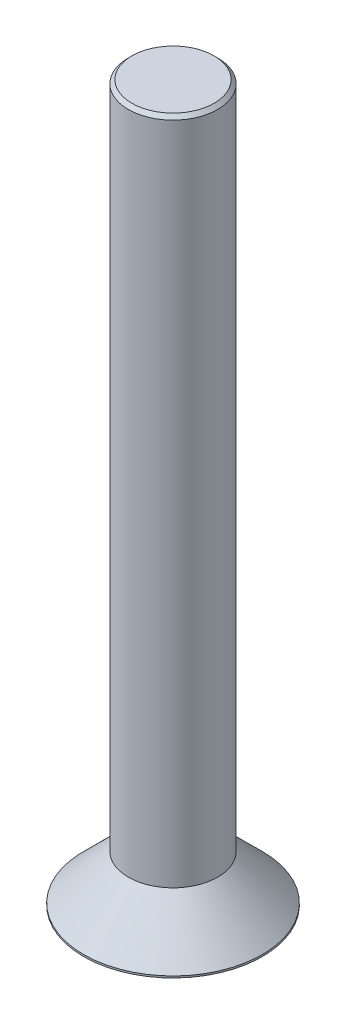
ISO-10303-21;
HEADER;
FILE_DESCRIPTION(('STEP AP214'),'2;1');
FILE_NAME('part.step','',(''),(''),'','','');
FILE_SCHEMA(('AUTOMOTIVE_DESIGN { 1 0 10303 214 1 1 1 1 }'));
ENDSEC;
DATA;
#1=APPLICATION_CONTEXT('core data for automotive mechanical design processes');
#2=APPLICATION_PROTOCOL_DEFINITION('international standard','automotive_design',2000,#1);
#3=PRODUCT_CONTEXT('',#1,'mechanical');
#4=PRODUCT('Part','Part','',(#3));
#5=PRODUCT_RELATED_PRODUCT_CATEGORY('part','',(#4));
#6=PRODUCT_DEFINITION_FORMATION('','',#4);
#7=PRODUCT_DEFINITION_CONTEXT('part definition',#1,'design');
#8=PRODUCT_DEFINITION('design','',#6,#7);
#9=PRODUCT_DEFINITION_SHAPE('','',#8);
#10=(LENGTH_UNIT() NAMED_UNIT(*) SI_UNIT(.MILLI.,.METRE.));
#11=(NAMED_UNIT(*) PLANE_ANGLE_UNIT() SI_UNIT($,.RADIAN.));
#12=(NAMED_UNIT(*) SI_UNIT($,.STERADIAN.) SOLID_ANGLE_UNIT());
#13=UNCERTAINTY_MEASURE_WITH_UNIT(LENGTH_MEASURE(1.E-05),#10,'distance_accuracy_value','');
#14=(GEOMETRIC_REPRESENTATION_CONTEXT(3) GLOBAL_UNCERTAINTY_ASSIGNED_CONTEXT((#13)) GLOBAL_UNIT_ASSIGNED_CONTEXT((#10,
#11,#12)) REPRESENTATION_CONTEXT('',''));
#15=CARTESIAN_POINT('',(0.,0.,0.));
#16=DIRECTION('',(0.,0.,1.));
#17=DIRECTION('',(1.,0.,0.));
#18=AXIS2_PLACEMENT_3D('',#15,#16,#17);
#19=CARTESIAN_POINT('',(0.,2.6,0.));
#20=DIRECTION('',(0.,-1.,0.));
#21=DIRECTION('',(0.,0.,-1.));
#22=AXIS2_PLACEMENT_3D('',#19,#20,#21);
#23=CYLINDRICAL_SURFACE('',#22,5.);
#24=CARTESIAN_POINT('',(0.,0.0999999999999916,0.));
#25=DIRECTION('',(0.,1.,0.));
#26=DIRECTION('',(0.,0.,1.));
#27=AXIS2_PLACEMENT_3D('',#24,#25,#26);
#28=CIRCLE('',#27,5.);
#29=CARTESIAN_POINT('',(0.,0.0999999999999916,5.));
#30=VERTEX_POINT('',#29);
#31=EDGE_CURVE('E153',#30,#30,#28,.F.);
#32=ORIENTED_EDGE('',*,*,#31,.T.);
#33=EDGE_LOOP('',(#32));
#34=FACE_BOUND('',#33,.T.);
#35=CARTESIAN_POINT('',(0.,0.,0.));
#36=DIRECTION('',(0.,1.,0.));
#37=DIRECTION('',(0.,0.,1.));
#38=AXIS2_PLACEMENT_3D('',#35,#36,#37);
#39=CIRCLE('',#38,5.);
#40=CARTESIAN_POINT('',(0.,0.,5.));
#41=VERTEX_POINT('',#40);
#42=EDGE_CURVE('E142',#41,#41,#39,.T.);
#43=ORIENTED_EDGE('',*,*,#42,.T.);
#44=EDGE_LOOP('',(#43));
#45=FACE_BOUND('',#44,.T.);
#46=ADVANCED_FACE('F39',(#34,#45),#23,.T.);
#47=CARTESIAN_POINT('',(0.,0.,0.));
#48=DIRECTION('',(0.,1.,0.));
#49=DIRECTION('',(0.,0.,1.));
#50=AXIS2_PLACEMENT_3D('',#47,#48,#49);
#51=PLANE('',#50);
#52=DIRECTION('',(0.,0.,1.));
#53=VECTOR('',#52,1.);
#54=CARTESIAN_POINT('',(1.54,0.,-0.889119414552024));
#55=LINE('',#54,#53);
#56=CARTESIAN_POINT('',(1.54,0.,-0.889119414552024));
#57=VERTEX_POINT('',#56);
#58=CARTESIAN_POINT('',(1.54,0.,0.889119414552024));
#59=VERTEX_POINT('',#58);
#60=EDGE_CURVE('E129',#57,#59,#55,.T.);
#61=ORIENTED_EDGE('',*,*,#60,.F.);
#62=DIRECTION('',(0.866025403784439,0.,0.5));
#63=VECTOR('',#62,1.);
#64=CARTESIAN_POINT('',(0.,0.,-1.77823882910405));
#65=LINE('',#64,#63);
#66=CARTESIAN_POINT('',(0.,0.,-1.77823882910405));
#67=VERTEX_POINT('',#66);
#68=EDGE_CURVE('E55',#67,#57,#65,.T.);
#69=ORIENTED_EDGE('',*,*,#68,.F.);
#70=DIRECTION('',(0.866025403784438,0.,-0.5));
#71=VECTOR('',#70,1.);
#72=CARTESIAN_POINT('',(-1.54,0.,-0.889119414552024));
#73=LINE('',#72,#71);
#74=CARTESIAN_POINT('',(-1.54,0.,-0.889119414552024));
#75=VERTEX_POINT('',#74);
#76=EDGE_CURVE('E138',#75,#67,#73,.T.);
#77=ORIENTED_EDGE('',*,*,#76,.F.);
#78=DIRECTION('',(0.,0.,-1.));
#79=VECTOR('',#78,1.);
#80=CARTESIAN_POINT('',(-1.54,0.,0.889119414552024));
#81=LINE('',#80,#79);
#82=CARTESIAN_POINT('',(-1.54,0.,0.889119414552024));
#83=VERTEX_POINT('',#82);
#84=EDGE_CURVE('E136',#83,#75,#81,.T.);
#85=ORIENTED_EDGE('',*,*,#84,.F.);
#86=DIRECTION('',(-0.866025403784439,0.,-0.5));
#87=VECTOR('',#86,1.);
#88=CARTESIAN_POINT('',(0.,0.,1.77823882910405));
#89=LINE('',#88,#87);
#90=CARTESIAN_POINT('',(0.,0.,1.77823882910405));
#91=VERTEX_POINT('',#90);
#92=EDGE_CURVE('E103',#91,#83,#89,.T.);
#93=ORIENTED_EDGE('',*,*,#92,.F.);
#94=DIRECTION('',(-0.866025403784439,0.,0.5));
#95=VECTOR('',#94,1.);
#96=CARTESIAN_POINT('',(1.54,0.,0.889119414552024));
#97=LINE('',#96,#95);
#98=EDGE_CURVE('E132',#59,#91,#97,.T.);
#99=ORIENTED_EDGE('',*,*,#98,.F.);
#100=EDGE_LOOP('',(#61,#69,#77,#85,#93,#99));
#101=FACE_BOUND('',#100,.T.);
#102=ORIENTED_EDGE('',*,*,#42,.F.);
#103=EDGE_LOOP('',(#102));
#104=FACE_BOUND('',#103,.T.);
#105=ADVANCED_FACE('F169',(#101,#104),#51,.F.);
#106=CARTESIAN_POINT('',(0.,2.6,0.));
#107=DIRECTION('',(0.,-1.,0.));
#108=DIRECTION('',(0.,0.,-1.));
#109=AXIS2_PLACEMENT_3D('',#106,#107,#108);
#110=CONICAL_SURFACE('',#109,2.5,0.785398163397447);
#111=ORIENTED_EDGE('',*,*,#31,.F.);
#112=EDGE_LOOP('',(#111));
#113=FACE_BOUND('',#112,.T.);
#114=CARTESIAN_POINT('',(0.,2.6,0.));
#115=DIRECTION('',(0.,1.,0.));
#116=DIRECTION('',(0.,0.,1.));
#117=AXIS2_PLACEMENT_3D('',#114,#115,#116);
#118=CIRCLE('',#117,2.5);
#119=CARTESIAN_POINT('',(0.,2.6,2.5));
#120=VERTEX_POINT('',#119);
#121=EDGE_CURVE('E150',#120,#120,#118,.T.);
#122=ORIENTED_EDGE('',*,*,#121,.F.);
#123=EDGE_LOOP('',(#122));
#124=FACE_BOUND('',#123,.T.);
#125=ADVANCED_FACE('F175',(#113,#124),#110,.T.);
#126=CARTESIAN_POINT('',(0.,0.95,-1.77823882910405));
#127=DIRECTION('',(0.5,0.,-0.866025403784439));
#128=DIRECTION('',(-0.866025403784439,0.,-0.5));
#129=AXIS2_PLACEMENT_3D('',#126,#127,#128);
#130=PLANE('',#129);
#131=ORIENTED_EDGE('',*,*,#68,.T.);
#132=DIRECTION('',(0.,-1.,0.));
#133=VECTOR('',#132,1.);
#134=CARTESIAN_POINT('',(1.54,0.95,-0.889119414552024));
#135=LINE('',#134,#133);
#136=CARTESIAN_POINT('',(1.54,0.95,-0.889119414552024));
#137=VERTEX_POINT('',#136);
#138=EDGE_CURVE('E85',#137,#57,#135,.T.);
#139=ORIENTED_EDGE('',*,*,#138,.F.);
#140=DIRECTION('',(0.866025403784439,0.,0.5));
#141=VECTOR('',#140,1.);
#142=CARTESIAN_POINT('',(0.,0.95,-1.77823882910405));
#143=LINE('',#142,#141);
#144=CARTESIAN_POINT('',(0.,0.95,-1.77823882910405));
#145=VERTEX_POINT('',#144);
#146=EDGE_CURVE('E140',#145,#137,#143,.T.);
#147=ORIENTED_EDGE('',*,*,#146,.F.);
#148=DIRECTION('',(0.,-1.,0.));
#149=VECTOR('',#148,1.);
#150=CARTESIAN_POINT('',(0.,0.95,-1.77823882910405));
#151=LINE('',#150,#149);
#152=EDGE_CURVE('E63',#145,#67,#151,.T.);
#153=ORIENTED_EDGE('',*,*,#152,.T.);
#154=EDGE_LOOP('',(#131,#139,#147,#153));
#155=FACE_BOUND('',#154,.T.);
#156=ADVANCED_FACE('F184',(#155),#130,.F.);
#157=CARTESIAN_POINT('',(-1.54,0.95,-0.889119414552024));
#158=DIRECTION('',(-0.5,0.,-0.866025403784439));
#159=DIRECTION('',(-0.866025403784439,0.,0.5));
#160=AXIS2_PLACEMENT_3D('',#157,#158,#159);
#161=PLANE('',#160);
#162=ORIENTED_EDGE('',*,*,#76,.T.);
#163=ORIENTED_EDGE('',*,*,#152,.F.);
#164=DIRECTION('',(0.866025403784438,0.,-0.5));
#165=VECTOR('',#164,1.);
#166=CARTESIAN_POINT('',(-1.54,0.95,-0.889119414552024));
#167=LINE('',#166,#165);
#168=CARTESIAN_POINT('',(-1.54,0.95,-0.889119414552024));
#169=VERTEX_POINT('',#168);
#170=EDGE_CURVE('E115',#169,#145,#167,.T.);
#171=ORIENTED_EDGE('',*,*,#170,.F.);
#172=DIRECTION('',(0.,-1.,0.));
#173=VECTOR('',#172,1.);
#174=CARTESIAN_POINT('',(-1.54,0.95,-0.889119414552024));
#175=LINE('',#174,#173);
#176=EDGE_CURVE('E107',#169,#75,#175,.T.);
#177=ORIENTED_EDGE('',*,*,#176,.T.);
#178=EDGE_LOOP('',(#162,#163,#171,#177));
#179=FACE_BOUND('',#178,.T.);
#180=ADVANCED_FACE('F189',(#179),#161,.F.);
#181=CARTESIAN_POINT('',(-1.54,0.95,0.889119414552024));
#182=DIRECTION('',(-1.,0.,0.));
#183=DIRECTION('',(0.,0.,1.));
#184=AXIS2_PLACEMENT_3D('',#181,#182,#183);
#185=PLANE('',#184);
#186=ORIENTED_EDGE('',*,*,#84,.T.);
#187=ORIENTED_EDGE('',*,*,#176,.F.);
#188=DIRECTION('',(0.,0.,-1.));
#189=VECTOR('',#188,1.);
#190=CARTESIAN_POINT('',(-1.54,0.95,0.889119414552024));
#191=LINE('',#190,#189);
#192=CARTESIAN_POINT('',(-1.54,0.95,0.889119414552024));
#193=VERTEX_POINT('',#192);
#194=EDGE_CURVE('E111',#193,#169,#191,.T.);
#195=ORIENTED_EDGE('',*,*,#194,.F.);
#196=DIRECTION('',(0.,-1.,0.));
#197=VECTOR('',#196,1.);
#198=CARTESIAN_POINT('',(-1.54,0.95,0.889119414552024));
#199=LINE('',#198,#197);
#200=EDGE_CURVE('E96',#193,#83,#199,.T.);
#201=ORIENTED_EDGE('',*,*,#200,.T.);
#202=EDGE_LOOP('',(#186,#187,#195,#201));
#203=FACE_BOUND('',#202,.T.);
#204=ADVANCED_FACE('F112',(#203),#185,.F.);
#205=CARTESIAN_POINT('',(0.,0.95,1.77823882910405));
#206=DIRECTION('',(-0.5,0.,0.866025403784439));
#207=DIRECTION('',(0.866025403784439,0.,0.5));
#208=AXIS2_PLACEMENT_3D('',#205,#206,#207);
#209=PLANE('',#208);
#210=ORIENTED_EDGE('',*,*,#92,.T.);
#211=ORIENTED_EDGE('',*,*,#200,.F.);
#212=DIRECTION('',(-0.866025403784439,0.,-0.5));
#213=VECTOR('',#212,1.);
#214=CARTESIAN_POINT('',(0.,0.95,1.77823882910405));
#215=LINE('',#214,#213);
#216=CARTESIAN_POINT('',(0.,0.95,1.77823882910405));
#217=VERTEX_POINT('',#216);
#218=EDGE_CURVE('E100',#217,#193,#215,.T.);
#219=ORIENTED_EDGE('',*,*,#218,.F.);
#220=DIRECTION('',(0.,-1.,0.));
#221=VECTOR('',#220,1.);
#222=CARTESIAN_POINT('',(0.,0.95,1.77823882910405));
#223=LINE('',#222,#221);
#224=EDGE_CURVE('E108',#217,#91,#223,.T.);
#225=ORIENTED_EDGE('',*,*,#224,.T.);
#226=EDGE_LOOP('',(#210,#211,#219,#225));
#227=FACE_BOUND('',#226,.T.);
#228=ADVANCED_FACE('F98',(#227),#209,.F.);
#229=CARTESIAN_POINT('',(1.54,0.95,0.889119414552024));
#230=DIRECTION('',(0.5,0.,0.866025403784439));
#231=DIRECTION('',(0.866025403784439,0.,-0.5));
#232=AXIS2_PLACEMENT_3D('',#229,#230,#231);
#233=PLANE('',#232);
#234=ORIENTED_EDGE('',*,*,#98,.T.);
#235=ORIENTED_EDGE('',*,*,#224,.F.);
#236=DIRECTION('',(-0.866025403784439,0.,0.5));
#237=VECTOR('',#236,1.);
#238=CARTESIAN_POINT('',(1.54,0.95,0.889119414552024));
#239=LINE('',#238,#237);
#240=CARTESIAN_POINT('',(1.54,0.95,0.889119414552024));
#241=VERTEX_POINT('',#240);
#242=EDGE_CURVE('E121',#241,#217,#239,.T.);
#243=ORIENTED_EDGE('',*,*,#242,.F.);
#244=DIRECTION('',(0.,-1.,0.));
#245=VECTOR('',#244,1.);
#246=CARTESIAN_POINT('',(1.54,0.95,0.889119414552024));
#247=LINE('',#246,#245);
#248=EDGE_CURVE('E145',#241,#59,#247,.T.);
#249=ORIENTED_EDGE('',*,*,#248,.T.);
#250=EDGE_LOOP('',(#234,#235,#243,#249));
#251=FACE_BOUND('',#250,.T.);
#252=ADVANCED_FACE('F209',(#251),#233,.F.);
#253=CARTESIAN_POINT('',(1.54,0.95,-0.889119414552024));
#254=DIRECTION('',(1.,0.,0.));
#255=DIRECTION('',(0.,0.,-1.));
#256=AXIS2_PLACEMENT_3D('',#253,#254,#255);
#257=PLANE('',#256);
#258=ORIENTED_EDGE('',*,*,#60,.T.);
#259=ORIENTED_EDGE('',*,*,#248,.F.);
#260=DIRECTION('',(0.,0.,1.));
#261=VECTOR('',#260,1.);
#262=CARTESIAN_POINT('',(1.54,0.95,-0.889119414552024));
#263=LINE('',#262,#261);
#264=EDGE_CURVE('E123',#137,#241,#263,.T.);
#265=ORIENTED_EDGE('',*,*,#264,.F.);
#266=ORIENTED_EDGE('',*,*,#138,.T.);
#267=EDGE_LOOP('',(#258,#259,#265,#266));
#268=FACE_BOUND('',#267,.T.);
#269=ADVANCED_FACE('F200',(#268),#257,.F.);
#270=CARTESIAN_POINT('',(0.,0.95,0.));
#271=DIRECTION('',(0.,-1.,0.));
#272=DIRECTION('',(0.,0.,-1.));
#273=AXIS2_PLACEMENT_3D('',#270,#271,#272);
#274=PLANE('',#273);
#275=ORIENTED_EDGE('',*,*,#146,.T.);
#276=ORIENTED_EDGE('',*,*,#264,.T.);
#277=ORIENTED_EDGE('',*,*,#242,.T.);
#278=ORIENTED_EDGE('',*,*,#218,.T.);
#279=ORIENTED_EDGE('',*,*,#194,.T.);
#280=ORIENTED_EDGE('',*,*,#170,.T.);
#281=EDGE_LOOP('',(#275,#276,#277,#278,#279,#280));
#282=FACE_BOUND('',#281,.T.);
#283=ADVANCED_FACE('F118',(#282),#274,.T.);
#284=CARTESIAN_POINT('',(0.,40.,0.));
#285=DIRECTION('',(0.,-1.,0.));
#286=DIRECTION('',(0.,0.,-1.));
#287=AXIS2_PLACEMENT_3D('',#284,#285,#286);
#288=CYLINDRICAL_SURFACE('',#287,2.5);
#289=CARTESIAN_POINT('',(0.,39.8,0.));
#290=DIRECTION('',(0.,1.,0.));
#291=DIRECTION('',(0.,0.,1.));
#292=AXIS2_PLACEMENT_3D('',#289,#290,#291);
#293=CIRCLE('',#292,2.5);
#294=CARTESIAN_POINT('',(0.,39.8,2.5));
#295=VERTEX_POINT('',#294);
#296=EDGE_CURVE('E11',#295,#295,#293,.F.);
#297=ORIENTED_EDGE('',*,*,#296,.T.);
#298=EDGE_LOOP('',(#297));
#299=FACE_BOUND('',#298,.T.);
#300=ORIENTED_EDGE('',*,*,#121,.T.);
#301=EDGE_LOOP('',(#300));
#302=FACE_BOUND('',#301,.T.);
#303=ADVANCED_FACE('F165',(#299,#302),#288,.T.);
#304=CARTESIAN_POINT('',(0.,40.,0.));
#305=DIRECTION('',(0.,1.,0.));
#306=DIRECTION('',(0.,0.,1.));
#307=AXIS2_PLACEMENT_3D('',#304,#305,#306);
#308=PLANE('',#307);
#309=CARTESIAN_POINT('',(0.,40.,0.));
#310=DIRECTION('',(0.,1.,0.));
#311=DIRECTION('',(0.,0.,1.));
#312=AXIS2_PLACEMENT_3D('',#309,#310,#311);
#313=CIRCLE('',#312,2.3);
#314=CARTESIAN_POINT('',(0.,40.,2.3));
#315=VERTEX_POINT('',#314);
#316=EDGE_CURVE('E48',#315,#315,#313,.T.);
#317=ORIENTED_EDGE('',*,*,#316,.T.);
#318=EDGE_LOOP('',(#317));
#319=FACE_BOUND('',#318,.T.);
#320=ADVANCED_FACE('F158',(#319),#308,.T.);
#321=CARTESIAN_POINT('',(0.,40.,0.));
#322=DIRECTION('',(0.,-1.,0.));
#323=DIRECTION('',(0.,0.,-1.));
#324=AXIS2_PLACEMENT_3D('',#321,#322,#323);
#325=CONICAL_SURFACE('',#324,2.3,0.785398163397434);
#326=ORIENTED_EDGE('',*,*,#296,.F.);
#327=EDGE_LOOP('',(#326));
#328=FACE_BOUND('',#327,.T.);
#329=ORIENTED_EDGE('',*,*,#316,.F.);
#330=EDGE_LOOP('',(#329));
#331=FACE_BOUND('',#330,.T.);
#332=ADVANCED_FACE('F42',(#328,#331),#325,.T.);
#333=CLOSED_SHELL('',(#46,#105,#125,#156,#180,#204,#228,#252,#269,#283,#303,#320,#332));
#334=MANIFOLD_SOLID_BREP('B2',#333);
#335=ADVANCED_BREP_SHAPE_REPRESENTATION('',(#18,#334),#14);
#336=SHAPE_DEFINITION_REPRESENTATION(#9,#335);
ENDSEC;
END-ISO-10303-21;
